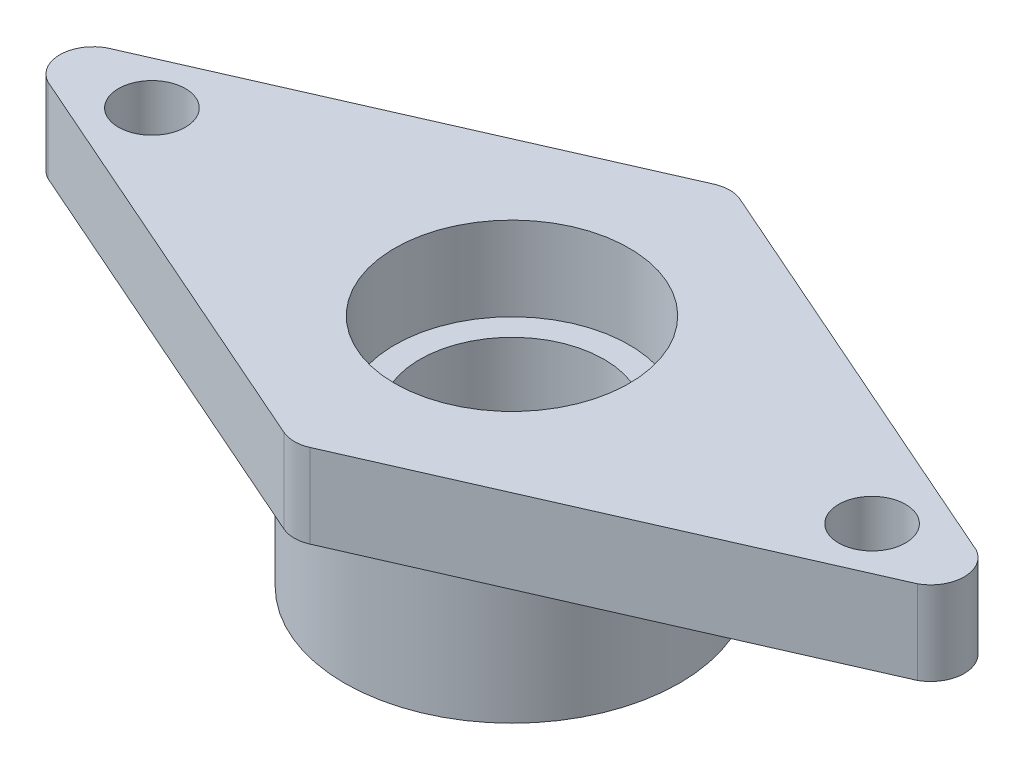
ISO-10303-21;
HEADER;
FILE_DESCRIPTION(('STEP AP214'),'2;1');
FILE_NAME('part.step','',(''),(''),'','','');
FILE_SCHEMA(('AUTOMOTIVE_DESIGN { 1 0 10303 214 1 1 1 1 }'));
ENDSEC;
DATA;
#1=APPLICATION_CONTEXT('core data for automotive mechanical design processes');
#2=APPLICATION_PROTOCOL_DEFINITION('international standard','automotive_design',2000,#1);
#3=PRODUCT_CONTEXT('',#1,'mechanical');
#4=PRODUCT('Part','Part','',(#3));
#5=PRODUCT_RELATED_PRODUCT_CATEGORY('part','',(#4));
#6=PRODUCT_DEFINITION_FORMATION('','',#4);
#7=PRODUCT_DEFINITION_CONTEXT('part definition',#1,'design');
#8=PRODUCT_DEFINITION('design','',#6,#7);
#9=PRODUCT_DEFINITION_SHAPE('','',#8);
#10=(LENGTH_UNIT() NAMED_UNIT(*) SI_UNIT(.MILLI.,.METRE.));
#11=(NAMED_UNIT(*) PLANE_ANGLE_UNIT() SI_UNIT($,.RADIAN.));
#12=(NAMED_UNIT(*) SI_UNIT($,.STERADIAN.) SOLID_ANGLE_UNIT());
#13=UNCERTAINTY_MEASURE_WITH_UNIT(LENGTH_MEASURE(1.E-05),#10,'distance_accuracy_value','');
#14=(GEOMETRIC_REPRESENTATION_CONTEXT(3) GLOBAL_UNCERTAINTY_ASSIGNED_CONTEXT((#13)) GLOBAL_UNIT_ASSIGNED_CONTEXT((#10,
#11,#12)) REPRESENTATION_CONTEXT('',''));
#15=CARTESIAN_POINT('',(0.,0.,0.));
#16=DIRECTION('',(0.,0.,1.));
#17=DIRECTION('',(1.,0.,0.));
#18=AXIS2_PLACEMENT_3D('',#15,#16,#17);
#19=CARTESIAN_POINT('',(5.5,0.,0.));
#20=DIRECTION('',(0.,1.,0.));
#21=DIRECTION('',(0.,0.,1.));
#22=AXIS2_PLACEMENT_3D('',#19,#20,#21);
#23=PLANE('',#22);
#24=CARTESIAN_POINT('',(0.,0.,0.));
#25=DIRECTION('',(0.,-1.,0.));
#26=DIRECTION('',(0.,0.,-1.));
#27=AXIS2_PLACEMENT_3D('',#24,#25,#26);
#28=CIRCLE('',#27,5.5);
#29=CARTESIAN_POINT('',(0.,0.,-5.5));
#30=VERTEX_POINT('',#29);
#31=EDGE_CURVE('E164',#30,#30,#28,.T.);
#32=ORIENTED_EDGE('',*,*,#31,.T.);
#33=EDGE_LOOP('',(#32));
#34=FACE_BOUND('',#33,.T.);
#35=CARTESIAN_POINT('',(0.,0.,0.));
#36=DIRECTION('',(0.,1.,0.));
#37=DIRECTION('',(0.,0.,1.));
#38=AXIS2_PLACEMENT_3D('',#35,#36,#37);
#39=CIRCLE('',#38,7.);
#40=CARTESIAN_POINT('',(0.,0.,7.));
#41=VERTEX_POINT('',#40);
#42=EDGE_CURVE('E11',#41,#41,#39,.F.);
#43=ORIENTED_EDGE('',*,*,#42,.F.);
#44=EDGE_LOOP('',(#43));
#45=FACE_BOUND('',#44,.T.);
#46=ADVANCED_FACE('F32',(#34,#45),#23,.T.);
#47=CARTESIAN_POINT('',(0.,0.,0.));
#48=DIRECTION('',(0.,-1.,0.));
#49=DIRECTION('',(0.,0.,-1.));
#50=AXIS2_PLACEMENT_3D('',#47,#48,#49);
#51=CYLINDRICAL_SURFACE('',#50,5.5);
#52=CARTESIAN_POINT('',(0.,-6.5,0.));
#53=DIRECTION('',(0.,-1.,0.));
#54=DIRECTION('',(0.,0.,-1.));
#55=AXIS2_PLACEMENT_3D('',#52,#53,#54);
#56=CIRCLE('',#55,5.5);
#57=CARTESIAN_POINT('',(0.,-6.5,-5.5));
#58=VERTEX_POINT('',#57);
#59=EDGE_CURVE('E41',#58,#58,#56,.T.);
#60=ORIENTED_EDGE('',*,*,#59,.T.);
#61=EDGE_LOOP('',(#60));
#62=FACE_BOUND('',#61,.T.);
#63=ORIENTED_EDGE('',*,*,#31,.F.);
#64=EDGE_LOOP('',(#63));
#65=FACE_BOUND('',#64,.T.);
#66=ADVANCED_FACE('F34',(#62,#65),#51,.F.);
#67=CARTESIAN_POINT('',(0.,-6.5,0.));
#68=DIRECTION('',(0.,-1.,0.));
#69=DIRECTION('',(0.,0.,-1.));
#70=AXIS2_PLACEMENT_3D('',#67,#68,#69);
#71=CONICAL_SURFACE('',#70,5.5,1.06369782240256);
#72=CARTESIAN_POINT('',(0.,-9.,0.));
#73=DIRECTION('',(0.,-1.,0.));
#74=DIRECTION('',(0.,0.,-1.));
#75=AXIS2_PLACEMENT_3D('',#72,#73,#74);
#76=CIRCLE('',#75,10.);
#77=CARTESIAN_POINT('',(0.,-9.,-10.));
#78=VERTEX_POINT('',#77);
#79=EDGE_CURVE('E167',#78,#78,#76,.T.);
#80=ORIENTED_EDGE('',*,*,#79,.T.);
#81=EDGE_LOOP('',(#80));
#82=FACE_BOUND('',#81,.T.);
#83=ORIENTED_EDGE('',*,*,#59,.F.);
#84=EDGE_LOOP('',(#83));
#85=FACE_BOUND('',#84,.T.);
#86=ADVANCED_FACE('F174',(#82,#85),#71,.F.);
#87=CARTESIAN_POINT('',(0.,0.,0.));
#88=DIRECTION('',(0.,-1.,0.));
#89=DIRECTION('',(0.,0.,-1.));
#90=AXIS2_PLACEMENT_3D('',#87,#88,#89);
#91=CYLINDRICAL_SURFACE('',#90,10.);
#92=CARTESIAN_POINT('',(0.,0.,0.));
#93=DIRECTION('',(0.,-1.,0.));
#94=DIRECTION('',(0.,0.,-1.));
#95=AXIS2_PLACEMENT_3D('',#92,#93,#94);
#96=CIRCLE('',#95,10.);
#97=CARTESIAN_POINT('',(0.,0.,-10.));
#98=VERTEX_POINT('',#97);
#99=EDGE_CURVE('E161',#98,#98,#96,.F.);
#100=ORIENTED_EDGE('',*,*,#99,.F.);
#101=EDGE_LOOP('',(#100));
#102=FACE_BOUND('',#101,.T.);
#103=ORIENTED_EDGE('',*,*,#79,.F.);
#104=EDGE_LOOP('',(#103));
#105=FACE_BOUND('',#104,.T.);
#106=ADVANCED_FACE('F176',(#102,#105),#91,.T.);
#107=CARTESIAN_POINT('',(0.,5.,-11.0613102246433));
#108=DIRECTION('',(0.,-1.,0.));
#109=DIRECTION('',(0.,0.,-1.));
#110=AXIS2_PLACEMENT_3D('',#107,#108,#109);
#111=PLANE('',#110);
#112=CARTESIAN_POINT('',(0.,5.,-11.0613102246433));
#113=DIRECTION('',(0.,1.,0.));
#114=DIRECTION('',(0.,0.,-1.));
#115=AXIS2_PLACEMENT_3D('',#112,#113,#114);
#116=CIRCLE('',#115,1.93868977535669);
#117=CARTESIAN_POINT('',(0.780909148563763,5.,-12.8357675914916));
#118=VERTEX_POINT('',#117);
#119=CARTESIAN_POINT('',(-0.780909148563762,5.,-12.8357675914916));
#120=VERTEX_POINT('',#119);
#121=EDGE_CURVE('E91',#118,#120,#116,.T.);
#122=ORIENTED_EDGE('',*,*,#121,.T.);
#123=DIRECTION('',(-0.915286906344656,0.,0.402802531116711));
#124=VECTOR('',#123,1.);
#125=CARTESIAN_POINT('',(-0.780909148563763,5.,-12.8357675914916));
#126=LINE('',#125,#124);
#127=CARTESIAN_POINT('',(-25.9568664374996,5.,-1.75624788136152));
#128=VERTEX_POINT('',#127);
#129=EDGE_CURVE('E258',#120,#128,#126,.T.);
#130=ORIENTED_EDGE('',*,*,#129,.T.);
#131=CARTESIAN_POINT('',(-25.,5.,0.));
#132=DIRECTION('',(0.,1.,0.));
#133=DIRECTION('',(0.,0.,-1.));
#134=AXIS2_PLACEMENT_3D('',#131,#132,#133);
#135=CIRCLE('',#134,2.);
#136=CARTESIAN_POINT('',(-25.9568664374996,5.,1.75624788136153));
#137=VERTEX_POINT('',#136);
#138=EDGE_CURVE('E260',#128,#137,#135,.T.);
#139=ORIENTED_EDGE('',*,*,#138,.T.);
#140=DIRECTION('',(0.915286906344656,0.,0.402802531116711));
#141=VECTOR('',#140,1.);
#142=CARTESIAN_POINT('',(-0.780909148563763,5.,12.8357675914916));
#143=LINE('',#142,#141);
#144=CARTESIAN_POINT('',(-0.780909148563763,5.,12.8357675914916));
#145=VERTEX_POINT('',#144);
#146=EDGE_CURVE('E262',#137,#145,#143,.T.);
#147=ORIENTED_EDGE('',*,*,#146,.T.);
#148=CARTESIAN_POINT('',(0.,5.,11.0613102246433));
#149=DIRECTION('',(0.,1.,0.));
#150=DIRECTION('',(0.,0.,-1.));
#151=AXIS2_PLACEMENT_3D('',#148,#149,#150);
#152=CIRCLE('',#151,1.93868977535669);
#153=CARTESIAN_POINT('',(0.780909148563762,5.,12.8357675914916));
#154=VERTEX_POINT('',#153);
#155=EDGE_CURVE('E112',#145,#154,#152,.T.);
#156=ORIENTED_EDGE('',*,*,#155,.T.);
#157=DIRECTION('',(0.915286906344656,0.,-0.402802531116711));
#158=VECTOR('',#157,1.);
#159=CARTESIAN_POINT('',(0.780909148563763,5.,12.8357675914916));
#160=LINE('',#159,#158);
#161=CARTESIAN_POINT('',(25.9568664374996,5.,1.75624788136153));
#162=VERTEX_POINT('',#161);
#163=EDGE_CURVE('E105',#154,#162,#160,.T.);
#164=ORIENTED_EDGE('',*,*,#163,.T.);
#165=CARTESIAN_POINT('',(25.,5.,0.));
#166=DIRECTION('',(0.,1.,0.));
#167=DIRECTION('',(0.,0.,1.));
#168=AXIS2_PLACEMENT_3D('',#165,#166,#167);
#169=CIRCLE('',#168,2.);
#170=CARTESIAN_POINT('',(25.9568664374996,5.,-1.75624788136152));
#171=VERTEX_POINT('',#170);
#172=EDGE_CURVE('E110',#162,#171,#169,.T.);
#173=ORIENTED_EDGE('',*,*,#172,.T.);
#174=DIRECTION('',(-0.915286906344656,0.,-0.402802531116711));
#175=VECTOR('',#174,1.);
#176=CARTESIAN_POINT('',(0.780909148563763,5.,-12.8357675914916));
#177=LINE('',#176,#175);
#178=EDGE_CURVE('E49',#171,#118,#177,.T.);
#179=ORIENTED_EDGE('',*,*,#178,.T.);
#180=EDGE_LOOP('',(#122,#130,#139,#147,#156,#164,#173,#179));
#181=FACE_BOUND('',#180,.T.);
#182=CARTESIAN_POINT('',(0.,5.,0.));
#183=DIRECTION('',(0.,1.,0.));
#184=DIRECTION('',(0.,0.,1.));
#185=AXIS2_PLACEMENT_3D('',#182,#183,#184);
#186=CIRCLE('',#185,7.);
#187=CARTESIAN_POINT('',(0.,5.,7.));
#188=VERTEX_POINT('',#187);
#189=EDGE_CURVE('E132',#188,#188,#186,.T.);
#190=ORIENTED_EDGE('',*,*,#189,.F.);
#191=EDGE_LOOP('',(#190));
#192=FACE_BOUND('',#191,.T.);
#193=CARTESIAN_POINT('',(21.5,5.,0.));
#194=DIRECTION('',(0.,1.,0.));
#195=DIRECTION('',(0.,0.,1.));
#196=AXIS2_PLACEMENT_3D('',#193,#194,#195);
#197=CIRCLE('',#196,2.);
#198=CARTESIAN_POINT('',(21.5,5.,2.));
#199=VERTEX_POINT('',#198);
#200=EDGE_CURVE('E250',#199,#199,#197,.T.);
#201=ORIENTED_EDGE('',*,*,#200,.F.);
#202=EDGE_LOOP('',(#201));
#203=FACE_BOUND('',#202,.T.);
#204=CARTESIAN_POINT('',(-21.5,5.,0.));
#205=DIRECTION('',(0.,1.,0.));
#206=DIRECTION('',(0.,0.,1.));
#207=AXIS2_PLACEMENT_3D('',#204,#205,#206);
#208=CIRCLE('',#207,2.);
#209=CARTESIAN_POINT('',(-21.5,5.,2.));
#210=VERTEX_POINT('',#209);
#211=EDGE_CURVE('E241',#210,#210,#208,.T.);
#212=ORIENTED_EDGE('',*,*,#211,.F.);
#213=EDGE_LOOP('',(#212));
#214=FACE_BOUND('',#213,.T.);
#215=ADVANCED_FACE('F107',(#181,#192,#203,#214),#111,.F.);
#216=CARTESIAN_POINT('',(0.,0.,-11.0613102246433));
#217=DIRECTION('',(0.,-1.,0.));
#218=DIRECTION('',(0.,0.,-1.));
#219=AXIS2_PLACEMENT_3D('',#216,#217,#218);
#220=PLANE('',#219);
#221=ORIENTED_EDGE('',*,*,#99,.T.);
#222=EDGE_LOOP('',(#221));
#223=FACE_BOUND('',#222,.T.);
#224=CARTESIAN_POINT('',(21.5,0.,0.));
#225=DIRECTION('',(0.,1.,0.));
#226=DIRECTION('',(0.,0.,1.));
#227=AXIS2_PLACEMENT_3D('',#224,#225,#226);
#228=CIRCLE('',#227,2.);
#229=CARTESIAN_POINT('',(21.5,0.,2.));
#230=VERTEX_POINT('',#229);
#231=EDGE_CURVE('E247',#230,#230,#228,.T.);
#232=ORIENTED_EDGE('',*,*,#231,.T.);
#233=EDGE_LOOP('',(#232));
#234=FACE_BOUND('',#233,.T.);
#235=CARTESIAN_POINT('',(0.,0.,-11.0613102246433));
#236=DIRECTION('',(0.,1.,0.));
#237=DIRECTION('',(0.,0.,1.));
#238=AXIS2_PLACEMENT_3D('',#235,#236,#237);
#239=CIRCLE('',#238,1.93868977535669);
#240=CARTESIAN_POINT('',(0.780909148563763,0.,-12.8357675914916));
#241=VERTEX_POINT('',#240);
#242=CARTESIAN_POINT('',(-0.780909148563762,0.,-12.8357675914916));
#243=VERTEX_POINT('',#242);
#244=EDGE_CURVE('E85',#241,#243,#239,.T.);
#245=ORIENTED_EDGE('',*,*,#244,.F.);
#246=DIRECTION('',(-0.915286906344656,0.,-0.402802531116711));
#247=VECTOR('',#246,1.);
#248=CARTESIAN_POINT('',(0.780909148563763,0.,-12.8357675914916));
#249=LINE('',#248,#247);
#250=CARTESIAN_POINT('',(25.9568664374996,0.,-1.75624788136152));
#251=VERTEX_POINT('',#250);
#252=EDGE_CURVE('E143',#251,#241,#249,.T.);
#253=ORIENTED_EDGE('',*,*,#252,.F.);
#254=CARTESIAN_POINT('',(25.,0.,0.));
#255=DIRECTION('',(0.,1.,0.));
#256=DIRECTION('',(0.,0.,1.));
#257=AXIS2_PLACEMENT_3D('',#254,#255,#256);
#258=CIRCLE('',#257,2.);
#259=CARTESIAN_POINT('',(25.9568664374996,0.,1.75624788136153));
#260=VERTEX_POINT('',#259);
#261=EDGE_CURVE('E78',#260,#251,#258,.T.);
#262=ORIENTED_EDGE('',*,*,#261,.F.);
#263=DIRECTION('',(0.915286906344656,0.,-0.402802531116711));
#264=VECTOR('',#263,1.);
#265=CARTESIAN_POINT('',(0.780909148563763,0.,12.8357675914916));
#266=LINE('',#265,#264);
#267=CARTESIAN_POINT('',(0.780909148563762,0.,12.8357675914916));
#268=VERTEX_POINT('',#267);
#269=EDGE_CURVE('E120',#268,#260,#266,.T.);
#270=ORIENTED_EDGE('',*,*,#269,.F.);
#271=CARTESIAN_POINT('',(0.,0.,11.0613102246433));
#272=DIRECTION('',(0.,1.,0.));
#273=DIRECTION('',(0.,0.,1.));
#274=AXIS2_PLACEMENT_3D('',#271,#272,#273);
#275=CIRCLE('',#274,1.93868977535669);
#276=CARTESIAN_POINT('',(-0.780909148563763,0.,12.8357675914916));
#277=VERTEX_POINT('',#276);
#278=EDGE_CURVE('E139',#277,#268,#275,.T.);
#279=ORIENTED_EDGE('',*,*,#278,.F.);
#280=DIRECTION('',(0.915286906344656,0.,0.402802531116711));
#281=VECTOR('',#280,1.);
#282=CARTESIAN_POINT('',(-0.780909148563763,0.,12.8357675914916));
#283=LINE('',#282,#281);
#284=CARTESIAN_POINT('',(-25.9568664374996,0.,1.75624788136153));
#285=VERTEX_POINT('',#284);
#286=EDGE_CURVE('E136',#285,#277,#283,.T.);
#287=ORIENTED_EDGE('',*,*,#286,.F.);
#288=CARTESIAN_POINT('',(-25.,0.,0.));
#289=DIRECTION('',(0.,1.,0.));
#290=DIRECTION('',(0.,0.,-1.));
#291=AXIS2_PLACEMENT_3D('',#288,#289,#290);
#292=CIRCLE('',#291,2.);
#293=CARTESIAN_POINT('',(-25.9568664374996,0.,-1.75624788136152));
#294=VERTEX_POINT('',#293);
#295=EDGE_CURVE('E134',#294,#285,#292,.T.);
#296=ORIENTED_EDGE('',*,*,#295,.F.);
#297=DIRECTION('',(-0.915286906344656,0.,0.402802531116711));
#298=VECTOR('',#297,1.);
#299=CARTESIAN_POINT('',(-0.780909148563763,0.,-12.8357675914916));
#300=LINE('',#299,#298);
#301=EDGE_CURVE('E131',#243,#294,#300,.T.);
#302=ORIENTED_EDGE('',*,*,#301,.F.);
#303=EDGE_LOOP('',(#245,#253,#262,#270,#279,#287,#296,#302));
#304=FACE_BOUND('',#303,.T.);
#305=CARTESIAN_POINT('',(-21.5,0.,0.));
#306=DIRECTION('',(0.,1.,0.));
#307=DIRECTION('',(0.,0.,1.));
#308=AXIS2_PLACEMENT_3D('',#305,#306,#307);
#309=CIRCLE('',#308,2.);
#310=CARTESIAN_POINT('',(-21.5,0.,2.));
#311=VERTEX_POINT('',#310);
#312=EDGE_CURVE('E244',#311,#311,#309,.T.);
#313=ORIENTED_EDGE('',*,*,#312,.T.);
#314=EDGE_LOOP('',(#313));
#315=FACE_BOUND('',#314,.T.);
#316=ADVANCED_FACE('F195',(#223,#234,#304,#315),#220,.T.);
#317=CARTESIAN_POINT('',(0.,5.,-11.0613102246433));
#318=DIRECTION('',(0.,-1.,0.));
#319=DIRECTION('',(0.,0.,-1.));
#320=AXIS2_PLACEMENT_3D('',#317,#318,#319);
#321=CYLINDRICAL_SURFACE('',#320,1.93868977535669);
#322=ORIENTED_EDGE('',*,*,#244,.T.);
#323=DIRECTION('',(0.,-1.,0.));
#324=VECTOR('',#323,1.);
#325=CARTESIAN_POINT('',(-0.780909148563762,5.,-12.8357675914916));
#326=LINE('',#325,#324);
#327=EDGE_CURVE('E158',#120,#243,#326,.T.);
#328=ORIENTED_EDGE('',*,*,#327,.F.);
#329=ORIENTED_EDGE('',*,*,#121,.F.);
#330=DIRECTION('',(0.,-1.,0.));
#331=VECTOR('',#330,1.);
#332=CARTESIAN_POINT('',(0.780909148563763,5.,-12.8357675914916));
#333=LINE('',#332,#331);
#334=EDGE_CURVE('E126',#118,#241,#333,.T.);
#335=ORIENTED_EDGE('',*,*,#334,.T.);
#336=EDGE_LOOP('',(#322,#328,#329,#335));
#337=FACE_BOUND('',#336,.T.);
#338=ADVANCED_FACE('F191',(#337),#321,.T.);
#339=CARTESIAN_POINT('',(-0.780909148563763,5.,-12.8357675914916));
#340=DIRECTION('',(0.402802531116711,0.,0.915286906344656));
#341=DIRECTION('',(0.915286906344656,0.,-0.402802531116711));
#342=AXIS2_PLACEMENT_3D('',#339,#340,#341);
#343=PLANE('',#342);
#344=ORIENTED_EDGE('',*,*,#301,.T.);
#345=DIRECTION('',(0.,-1.,0.));
#346=VECTOR('',#345,1.);
#347=CARTESIAN_POINT('',(-25.9568664374996,5.,-1.75624788136152));
#348=LINE('',#347,#346);
#349=EDGE_CURVE('E155',#128,#294,#348,.T.);
#350=ORIENTED_EDGE('',*,*,#349,.F.);
#351=ORIENTED_EDGE('',*,*,#129,.F.);
#352=ORIENTED_EDGE('',*,*,#327,.T.);
#353=EDGE_LOOP('',(#344,#350,#351,#352));
#354=FACE_BOUND('',#353,.T.);
#355=ADVANCED_FACE('F194',(#354),#343,.F.);
#356=CARTESIAN_POINT('',(-25.,5.,0.));
#357=DIRECTION('',(0.,-1.,0.));
#358=DIRECTION('',(0.,0.,-1.));
#359=AXIS2_PLACEMENT_3D('',#356,#357,#358);
#360=CYLINDRICAL_SURFACE('',#359,2.);
#361=ORIENTED_EDGE('',*,*,#295,.T.);
#362=DIRECTION('',(0.,-1.,0.));
#363=VECTOR('',#362,1.);
#364=CARTESIAN_POINT('',(-25.9568664374996,5.,1.75624788136153));
#365=LINE('',#364,#363);
#366=EDGE_CURVE('E152',#137,#285,#365,.T.);
#367=ORIENTED_EDGE('',*,*,#366,.F.);
#368=ORIENTED_EDGE('',*,*,#138,.F.);
#369=ORIENTED_EDGE('',*,*,#349,.T.);
#370=EDGE_LOOP('',(#361,#367,#368,#369));
#371=FACE_BOUND('',#370,.T.);
#372=ADVANCED_FACE('F199',(#371),#360,.T.);
#373=CARTESIAN_POINT('',(-0.780909148563763,5.,12.8357675914916));
#374=DIRECTION('',(0.402802531116711,0.,-0.915286906344656));
#375=DIRECTION('',(-0.915286906344656,0.,-0.402802531116711));
#376=AXIS2_PLACEMENT_3D('',#373,#374,#375);
#377=PLANE('',#376);
#378=ORIENTED_EDGE('',*,*,#286,.T.);
#379=DIRECTION('',(0.,-1.,0.));
#380=VECTOR('',#379,1.);
#381=CARTESIAN_POINT('',(-0.780909148563763,5.,12.8357675914916));
#382=LINE('',#381,#380);
#383=EDGE_CURVE('E149',#145,#277,#382,.T.);
#384=ORIENTED_EDGE('',*,*,#383,.F.);
#385=ORIENTED_EDGE('',*,*,#146,.F.);
#386=ORIENTED_EDGE('',*,*,#366,.T.);
#387=EDGE_LOOP('',(#378,#384,#385,#386));
#388=FACE_BOUND('',#387,.T.);
#389=ADVANCED_FACE('F203',(#388),#377,.F.);
#390=CARTESIAN_POINT('',(0.,5.,11.0613102246433));
#391=DIRECTION('',(0.,-1.,0.));
#392=DIRECTION('',(0.,0.,-1.));
#393=AXIS2_PLACEMENT_3D('',#390,#391,#392);
#394=CYLINDRICAL_SURFACE('',#393,1.93868977535669);
#395=ORIENTED_EDGE('',*,*,#278,.T.);
#396=DIRECTION('',(0.,-1.,0.));
#397=VECTOR('',#396,1.);
#398=CARTESIAN_POINT('',(0.780909148563762,5.,12.8357675914916));
#399=LINE('',#398,#397);
#400=EDGE_CURVE('E121',#154,#268,#399,.T.);
#401=ORIENTED_EDGE('',*,*,#400,.F.);
#402=ORIENTED_EDGE('',*,*,#155,.F.);
#403=ORIENTED_EDGE('',*,*,#383,.T.);
#404=EDGE_LOOP('',(#395,#401,#402,#403));
#405=FACE_BOUND('',#404,.T.);
#406=ADVANCED_FACE('F207',(#405),#394,.T.);
#407=CARTESIAN_POINT('',(0.780909148563763,5.,12.8357675914916));
#408=DIRECTION('',(-0.402802531116711,0.,-0.915286906344656));
#409=DIRECTION('',(-0.915286906344656,0.,0.402802531116711));
#410=AXIS2_PLACEMENT_3D('',#407,#408,#409);
#411=PLANE('',#410);
#412=ORIENTED_EDGE('',*,*,#269,.T.);
#413=DIRECTION('',(0.,-1.,0.));
#414=VECTOR('',#413,1.);
#415=CARTESIAN_POINT('',(25.9568664374996,5.,1.75624788136153));
#416=LINE('',#415,#414);
#417=EDGE_CURVE('E117',#162,#260,#416,.T.);
#418=ORIENTED_EDGE('',*,*,#417,.F.);
#419=ORIENTED_EDGE('',*,*,#163,.F.);
#420=ORIENTED_EDGE('',*,*,#400,.T.);
#421=EDGE_LOOP('',(#412,#418,#419,#420));
#422=FACE_BOUND('',#421,.T.);
#423=ADVANCED_FACE('F118',(#422),#411,.F.);
#424=CARTESIAN_POINT('',(25.,5.,0.));
#425=DIRECTION('',(0.,-1.,0.));
#426=DIRECTION('',(0.,0.,-1.));
#427=AXIS2_PLACEMENT_3D('',#424,#425,#426);
#428=CYLINDRICAL_SURFACE('',#427,2.);
#429=ORIENTED_EDGE('',*,*,#261,.T.);
#430=DIRECTION('',(0.,-1.,0.));
#431=VECTOR('',#430,1.);
#432=CARTESIAN_POINT('',(25.9568664374996,5.,-1.75624788136152));
#433=LINE('',#432,#431);
#434=EDGE_CURVE('E122',#171,#251,#433,.T.);
#435=ORIENTED_EDGE('',*,*,#434,.F.);
#436=ORIENTED_EDGE('',*,*,#172,.F.);
#437=ORIENTED_EDGE('',*,*,#417,.T.);
#438=EDGE_LOOP('',(#429,#435,#436,#437));
#439=FACE_BOUND('',#438,.T.);
#440=ADVANCED_FACE('F124',(#439),#428,.T.);
#441=CARTESIAN_POINT('',(0.780909148563763,5.,-12.8357675914916));
#442=DIRECTION('',(-0.402802531116711,0.,0.915286906344656));
#443=DIRECTION('',(0.915286906344656,0.,0.402802531116711));
#444=AXIS2_PLACEMENT_3D('',#441,#442,#443);
#445=PLANE('',#444);
#446=ORIENTED_EDGE('',*,*,#252,.T.);
#447=ORIENTED_EDGE('',*,*,#334,.F.);
#448=ORIENTED_EDGE('',*,*,#178,.F.);
#449=ORIENTED_EDGE('',*,*,#434,.T.);
#450=EDGE_LOOP('',(#446,#447,#448,#449));
#451=FACE_BOUND('',#450,.T.);
#452=ADVANCED_FACE('F216',(#451),#445,.F.);
#453=CARTESIAN_POINT('',(0.,5.,0.));
#454=DIRECTION('',(0.,-1.,0.));
#455=DIRECTION('',(0.,0.,-1.));
#456=AXIS2_PLACEMENT_3D('',#453,#454,#455);
#457=CYLINDRICAL_SURFACE('',#456,7.);
#458=ORIENTED_EDGE('',*,*,#189,.T.);
#459=EDGE_LOOP('',(#458));
#460=FACE_BOUND('',#459,.T.);
#461=ORIENTED_EDGE('',*,*,#42,.T.);
#462=EDGE_LOOP('',(#461));
#463=FACE_BOUND('',#462,.T.);
#464=ADVANCED_FACE('F219',(#460,#463),#457,.F.);
#465=CARTESIAN_POINT('',(21.5,5.,0.));
#466=DIRECTION('',(0.,-1.,0.));
#467=DIRECTION('',(0.,0.,-1.));
#468=AXIS2_PLACEMENT_3D('',#465,#466,#467);
#469=CYLINDRICAL_SURFACE('',#468,2.);
#470=ORIENTED_EDGE('',*,*,#200,.T.);
#471=EDGE_LOOP('',(#470));
#472=FACE_BOUND('',#471,.T.);
#473=ORIENTED_EDGE('',*,*,#231,.F.);
#474=EDGE_LOOP('',(#473));
#475=FACE_BOUND('',#474,.T.);
#476=ADVANCED_FACE('F228',(#472,#475),#469,.F.);
#477=CARTESIAN_POINT('',(-21.5,5.,0.));
#478=DIRECTION('',(0.,-1.,0.));
#479=DIRECTION('',(0.,0.,-1.));
#480=AXIS2_PLACEMENT_3D('',#477,#478,#479);
#481=CYLINDRICAL_SURFACE('',#480,2.);
#482=ORIENTED_EDGE('',*,*,#211,.T.);
#483=EDGE_LOOP('',(#482));
#484=FACE_BOUND('',#483,.T.);
#485=ORIENTED_EDGE('',*,*,#312,.F.);
#486=EDGE_LOOP('',(#485));
#487=FACE_BOUND('',#486,.T.);
#488=ADVANCED_FACE('F232',(#484,#487),#481,.F.);
#489=CLOSED_SHELL('',(#46,#66,#86,#106,#215,#316,#338,#355,#372,#389,#406,#423,#440,#452,#464,
#476,#488));
#490=MANIFOLD_SOLID_BREP('B2',#489);
#491=ADVANCED_BREP_SHAPE_REPRESENTATION('',(#18,#490),#14);
#492=SHAPE_DEFINITION_REPRESENTATION(#9,#491);
ENDSEC;
END-ISO-10303-21;
